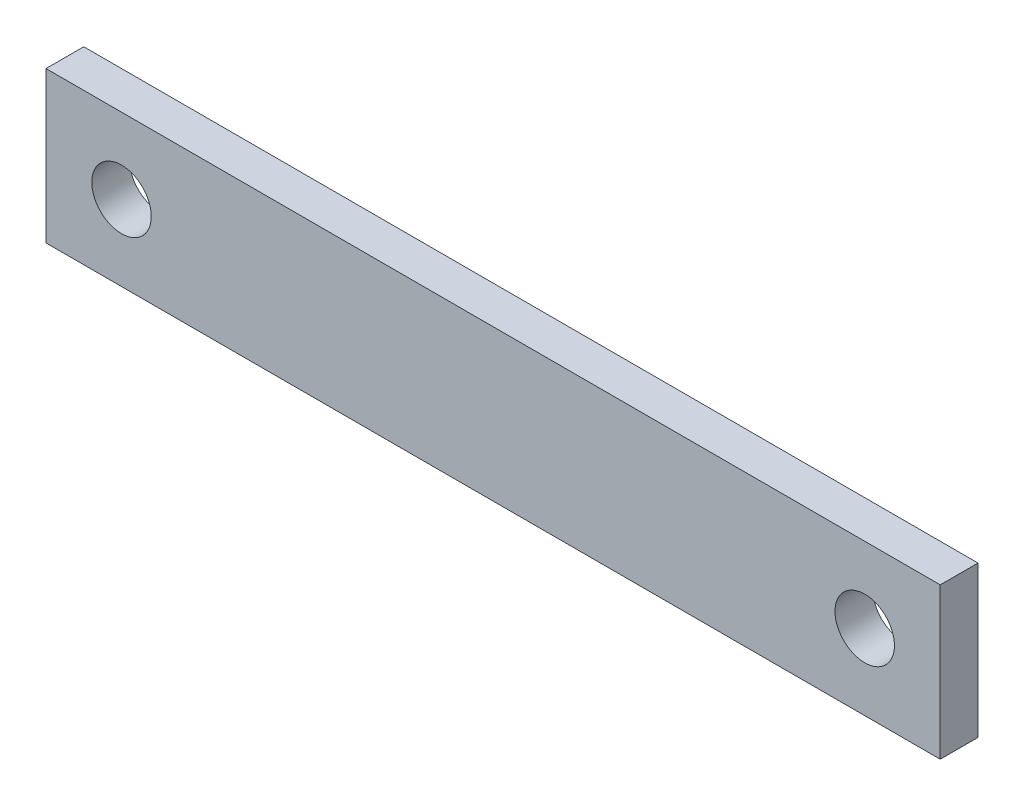
ISO-10303-21;
HEADER;
FILE_DESCRIPTION(('STEP AP214'),'2;1');
FILE_NAME('part.step','',(''),(''),'','','');
FILE_SCHEMA(('AUTOMOTIVE_DESIGN { 1 0 10303 214 1 1 1 1 }'));
ENDSEC;
DATA;
#1=APPLICATION_CONTEXT('core data for automotive mechanical design processes');
#2=APPLICATION_PROTOCOL_DEFINITION('international standard','automotive_design',2000,#1);
#3=PRODUCT_CONTEXT('',#1,'mechanical');
#4=PRODUCT('Part','Part','',(#3));
#5=PRODUCT_RELATED_PRODUCT_CATEGORY('part','',(#4));
#6=PRODUCT_DEFINITION_FORMATION('','',#4);
#7=PRODUCT_DEFINITION_CONTEXT('part definition',#1,'design');
#8=PRODUCT_DEFINITION('design','',#6,#7);
#9=PRODUCT_DEFINITION_SHAPE('','',#8);
#10=(LENGTH_UNIT() NAMED_UNIT(*) SI_UNIT(.MILLI.,.METRE.));
#11=(NAMED_UNIT(*) PLANE_ANGLE_UNIT() SI_UNIT($,.RADIAN.));
#12=(NAMED_UNIT(*) SI_UNIT($,.STERADIAN.) SOLID_ANGLE_UNIT());
#13=UNCERTAINTY_MEASURE_WITH_UNIT(LENGTH_MEASURE(1.E-05),#10,'distance_accuracy_value','');
#14=(GEOMETRIC_REPRESENTATION_CONTEXT(3) GLOBAL_UNCERTAINTY_ASSIGNED_CONTEXT((#13)) GLOBAL_UNIT_ASSIGNED_CONTEXT((#10,
#11,#12)) REPRESENTATION_CONTEXT('',''));
#15=CARTESIAN_POINT('',(0.,0.,0.));
#16=DIRECTION('',(0.,0.,1.));
#17=DIRECTION('',(1.,0.,0.));
#18=AXIS2_PLACEMENT_3D('',#15,#16,#17);
#19=CARTESIAN_POINT('',(0.,0.,-6.35));
#20=DIRECTION('',(-1.,0.,0.));
#21=DIRECTION('',(0.,0.,1.));
#22=AXIS2_PLACEMENT_3D('',#19,#20,#21);
#23=PLANE('',#22);
#24=DIRECTION('',(0.,-1.,0.));
#25=VECTOR('',#24,1.);
#26=CARTESIAN_POINT('',(0.,0.,0.));
#27=LINE('',#26,#25);
#28=CARTESIAN_POINT('',(0.,25.4,0.));
#29=VERTEX_POINT('',#28);
#30=CARTESIAN_POINT('',(0.,0.,0.));
#31=VERTEX_POINT('',#30);
#32=EDGE_CURVE('E122',#29,#31,#27,.T.);
#33=ORIENTED_EDGE('',*,*,#32,.F.);
#34=DIRECTION('',(0.,0.,1.));
#35=VECTOR('',#34,1.);
#36=CARTESIAN_POINT('',(0.,25.4,-6.35));
#37=LINE('',#36,#35);
#38=CARTESIAN_POINT('',(0.,25.4,-6.35));
#39=VERTEX_POINT('',#38);
#40=EDGE_CURVE('E11',#39,#29,#37,.T.);
#41=ORIENTED_EDGE('',*,*,#40,.F.);
#42=DIRECTION('',(0.,-1.,0.));
#43=VECTOR('',#42,1.);
#44=CARTESIAN_POINT('',(0.,0.,-6.35));
#45=LINE('',#44,#43);
#46=CARTESIAN_POINT('',(0.,0.,-6.35));
#47=VERTEX_POINT('',#46);
#48=EDGE_CURVE('E112',#39,#47,#45,.T.);
#49=ORIENTED_EDGE('',*,*,#48,.T.);
#50=DIRECTION('',(0.,0.,1.));
#51=VECTOR('',#50,1.);
#52=CARTESIAN_POINT('',(0.,0.,-6.35));
#53=LINE('',#52,#51);
#54=EDGE_CURVE('E45',#47,#31,#53,.T.);
#55=ORIENTED_EDGE('',*,*,#54,.T.);
#56=EDGE_LOOP('',(#33,#41,#49,#55));
#57=FACE_BOUND('',#56,.T.);
#58=ADVANCED_FACE('F42',(#57),#23,.T.);
#59=CARTESIAN_POINT('',(0.,25.4,-6.35));
#60=DIRECTION('',(0.,1.,0.));
#61=DIRECTION('',(0.,0.,1.));
#62=AXIS2_PLACEMENT_3D('',#59,#60,#61);
#63=PLANE('',#62);
#64=DIRECTION('',(-1.,0.,0.));
#65=VECTOR('',#64,1.);
#66=CARTESIAN_POINT('',(0.,25.4,0.));
#67=LINE('',#66,#65);
#68=CARTESIAN_POINT('',(150.368,25.4,0.));
#69=VERTEX_POINT('',#68);
#70=EDGE_CURVE('E116',#69,#29,#67,.T.);
#71=ORIENTED_EDGE('',*,*,#70,.F.);
#72=DIRECTION('',(0.,0.,1.));
#73=VECTOR('',#72,1.);
#74=CARTESIAN_POINT('',(150.368,25.4,-6.35));
#75=LINE('',#74,#73);
#76=CARTESIAN_POINT('',(150.368,25.4,-6.35));
#77=VERTEX_POINT('',#76);
#78=EDGE_CURVE('E52',#77,#69,#75,.T.);
#79=ORIENTED_EDGE('',*,*,#78,.F.);
#80=DIRECTION('',(-1.,0.,0.));
#81=VECTOR('',#80,1.);
#82=CARTESIAN_POINT('',(0.,25.4,-6.35));
#83=LINE('',#82,#81);
#84=EDGE_CURVE('E107',#77,#39,#83,.T.);
#85=ORIENTED_EDGE('',*,*,#84,.T.);
#86=ORIENTED_EDGE('',*,*,#40,.T.);
#87=EDGE_LOOP('',(#71,#79,#85,#86));
#88=FACE_BOUND('',#87,.T.);
#89=ADVANCED_FACE('F148',(#88),#63,.T.);
#90=CARTESIAN_POINT('',(150.368,0.,-6.35));
#91=DIRECTION('',(1.,0.,0.));
#92=DIRECTION('',(0.,0.,-1.));
#93=AXIS2_PLACEMENT_3D('',#90,#91,#92);
#94=PLANE('',#93);
#95=DIRECTION('',(0.,1.,0.));
#96=VECTOR('',#95,1.);
#97=CARTESIAN_POINT('',(150.368,0.,0.));
#98=LINE('',#97,#96);
#99=CARTESIAN_POINT('',(150.368,0.,0.));
#100=VERTEX_POINT('',#99);
#101=EDGE_CURVE('E101',#100,#69,#98,.T.);
#102=ORIENTED_EDGE('',*,*,#101,.F.);
#103=DIRECTION('',(0.,0.,1.));
#104=VECTOR('',#103,1.);
#105=CARTESIAN_POINT('',(150.368,0.,-6.35));
#106=LINE('',#105,#104);
#107=CARTESIAN_POINT('',(150.368,0.,-6.35));
#108=VERTEX_POINT('',#107);
#109=EDGE_CURVE('E96',#108,#100,#106,.T.);
#110=ORIENTED_EDGE('',*,*,#109,.F.);
#111=DIRECTION('',(0.,1.,0.));
#112=VECTOR('',#111,1.);
#113=CARTESIAN_POINT('',(150.368,0.,-6.35));
#114=LINE('',#113,#112);
#115=EDGE_CURVE('E99',#108,#77,#114,.T.);
#116=ORIENTED_EDGE('',*,*,#115,.T.);
#117=ORIENTED_EDGE('',*,*,#78,.T.);
#118=EDGE_LOOP('',(#102,#110,#116,#117));
#119=FACE_BOUND('',#118,.T.);
#120=ADVANCED_FACE('F98',(#119),#94,.T.);
#121=CARTESIAN_POINT('',(0.,0.,-6.35));
#122=DIRECTION('',(0.,-1.,0.));
#123=DIRECTION('',(0.,0.,-1.));
#124=AXIS2_PLACEMENT_3D('',#121,#122,#123);
#125=PLANE('',#124);
#126=DIRECTION('',(1.,0.,0.));
#127=VECTOR('',#126,1.);
#128=CARTESIAN_POINT('',(0.,0.,0.));
#129=LINE('',#128,#127);
#130=EDGE_CURVE('E126',#31,#100,#129,.T.);
#131=ORIENTED_EDGE('',*,*,#130,.F.);
#132=ORIENTED_EDGE('',*,*,#54,.F.);
#133=DIRECTION('',(1.,0.,0.));
#134=VECTOR('',#133,1.);
#135=CARTESIAN_POINT('',(0.,0.,-6.35));
#136=LINE('',#135,#134);
#137=EDGE_CURVE('E106',#47,#108,#136,.T.);
#138=ORIENTED_EDGE('',*,*,#137,.T.);
#139=ORIENTED_EDGE('',*,*,#109,.T.);
#140=EDGE_LOOP('',(#131,#132,#138,#139));
#141=FACE_BOUND('',#140,.T.);
#142=ADVANCED_FACE('F110',(#141),#125,.T.);
#143=CARTESIAN_POINT('',(0.,0.,-6.35));
#144=DIRECTION('',(0.,0.,-1.));
#145=DIRECTION('',(-1.,0.,0.));
#146=AXIS2_PLACEMENT_3D('',#143,#144,#145);
#147=PLANE('',#146);
#148=CARTESIAN_POINT('',(12.7,12.7,-6.35));
#149=DIRECTION('',(0.,0.,1.));
#150=DIRECTION('',(1.,0.,0.));
#151=AXIS2_PLACEMENT_3D('',#148,#149,#150);
#152=CIRCLE('',#151,5.0000027);
#153=CARTESIAN_POINT('',(17.7000027,12.7,-6.35));
#154=VERTEX_POINT('',#153);
#155=EDGE_CURVE('E137',#154,#154,#152,.T.);
#156=ORIENTED_EDGE('',*,*,#155,.T.);
#157=EDGE_LOOP('',(#156));
#158=FACE_BOUND('',#157,.T.);
#159=CARTESIAN_POINT('',(137.668,12.7,-6.35));
#160=DIRECTION('',(0.,0.,1.));
#161=DIRECTION('',(1.,0.,0.));
#162=AXIS2_PLACEMENT_3D('',#159,#160,#161);
#163=CIRCLE('',#162,5.0000027);
#164=CARTESIAN_POINT('',(142.6680027,12.7,-6.35));
#165=VERTEX_POINT('',#164);
#166=EDGE_CURVE('E127',#165,#165,#163,.T.);
#167=ORIENTED_EDGE('',*,*,#166,.T.);
#168=EDGE_LOOP('',(#167));
#169=FACE_BOUND('',#168,.T.);
#170=ORIENTED_EDGE('',*,*,#48,.F.);
#171=ORIENTED_EDGE('',*,*,#84,.F.);
#172=ORIENTED_EDGE('',*,*,#115,.F.);
#173=ORIENTED_EDGE('',*,*,#137,.F.);
#174=EDGE_LOOP('',(#170,#171,#172,#173));
#175=FACE_BOUND('',#174,.T.);
#176=ADVANCED_FACE('F105',(#158,#169,#175),#147,.T.);
#177=CARTESIAN_POINT('',(0.,0.,0.));
#178=DIRECTION('',(0.,0.,-1.));
#179=DIRECTION('',(-1.,0.,0.));
#180=AXIS2_PLACEMENT_3D('',#177,#178,#179);
#181=PLANE('',#180);
#182=CARTESIAN_POINT('',(12.7,12.7,0.));
#183=DIRECTION('',(0.,0.,1.));
#184=DIRECTION('',(1.,0.,0.));
#185=AXIS2_PLACEMENT_3D('',#182,#183,#184);
#186=CIRCLE('',#185,5.0000027);
#187=CARTESIAN_POINT('',(17.7000027,12.7,0.));
#188=VERTEX_POINT('',#187);
#189=EDGE_CURVE('E141',#188,#188,#186,.T.);
#190=ORIENTED_EDGE('',*,*,#189,.F.);
#191=EDGE_LOOP('',(#190));
#192=FACE_BOUND('',#191,.T.);
#193=CARTESIAN_POINT('',(137.668,12.7,0.));
#194=DIRECTION('',(0.,0.,1.));
#195=DIRECTION('',(1.,0.,0.));
#196=AXIS2_PLACEMENT_3D('',#193,#194,#195);
#197=CIRCLE('',#196,5.0000027);
#198=CARTESIAN_POINT('',(142.6680027,12.7,0.));
#199=VERTEX_POINT('',#198);
#200=EDGE_CURVE('E140',#199,#199,#197,.T.);
#201=ORIENTED_EDGE('',*,*,#200,.F.);
#202=EDGE_LOOP('',(#201));
#203=FACE_BOUND('',#202,.T.);
#204=ORIENTED_EDGE('',*,*,#32,.T.);
#205=ORIENTED_EDGE('',*,*,#130,.T.);
#206=ORIENTED_EDGE('',*,*,#101,.T.);
#207=ORIENTED_EDGE('',*,*,#70,.T.);
#208=EDGE_LOOP('',(#204,#205,#206,#207));
#209=FACE_BOUND('',#208,.T.);
#210=ADVANCED_FACE('F147',(#192,#203,#209),#181,.F.);
#211=CARTESIAN_POINT('',(137.668,12.7,-6.35));
#212=DIRECTION('',(0.,0.,1.));
#213=DIRECTION('',(1.,0.,0.));
#214=AXIS2_PLACEMENT_3D('',#211,#212,#213);
#215=CYLINDRICAL_SURFACE('',#214,5.0000027);
#216=ORIENTED_EDGE('',*,*,#166,.F.);
#217=EDGE_LOOP('',(#216));
#218=FACE_BOUND('',#217,.T.);
#219=ORIENTED_EDGE('',*,*,#200,.T.);
#220=EDGE_LOOP('',(#219));
#221=FACE_BOUND('',#220,.T.);
#222=ADVANCED_FACE('F166',(#218,#221),#215,.F.);
#223=CARTESIAN_POINT('',(12.7,12.7,-6.35));
#224=DIRECTION('',(0.,0.,1.));
#225=DIRECTION('',(1.,0.,0.));
#226=AXIS2_PLACEMENT_3D('',#223,#224,#225);
#227=CYLINDRICAL_SURFACE('',#226,5.0000027);
#228=ORIENTED_EDGE('',*,*,#155,.F.);
#229=EDGE_LOOP('',(#228));
#230=FACE_BOUND('',#229,.T.);
#231=ORIENTED_EDGE('',*,*,#189,.T.);
#232=EDGE_LOOP('',(#231));
#233=FACE_BOUND('',#232,.T.);
#234=ADVANCED_FACE('F172',(#230,#233),#227,.F.);
#235=CLOSED_SHELL('',(#58,#89,#120,#142,#176,#210,#222,#234));
#236=MANIFOLD_SOLID_BREP('B2',#235);
#237=ADVANCED_BREP_SHAPE_REPRESENTATION('',(#18,#236),#14);
#238=SHAPE_DEFINITION_REPRESENTATION(#9,#237);
ENDSEC;
END-ISO-10303-21;
